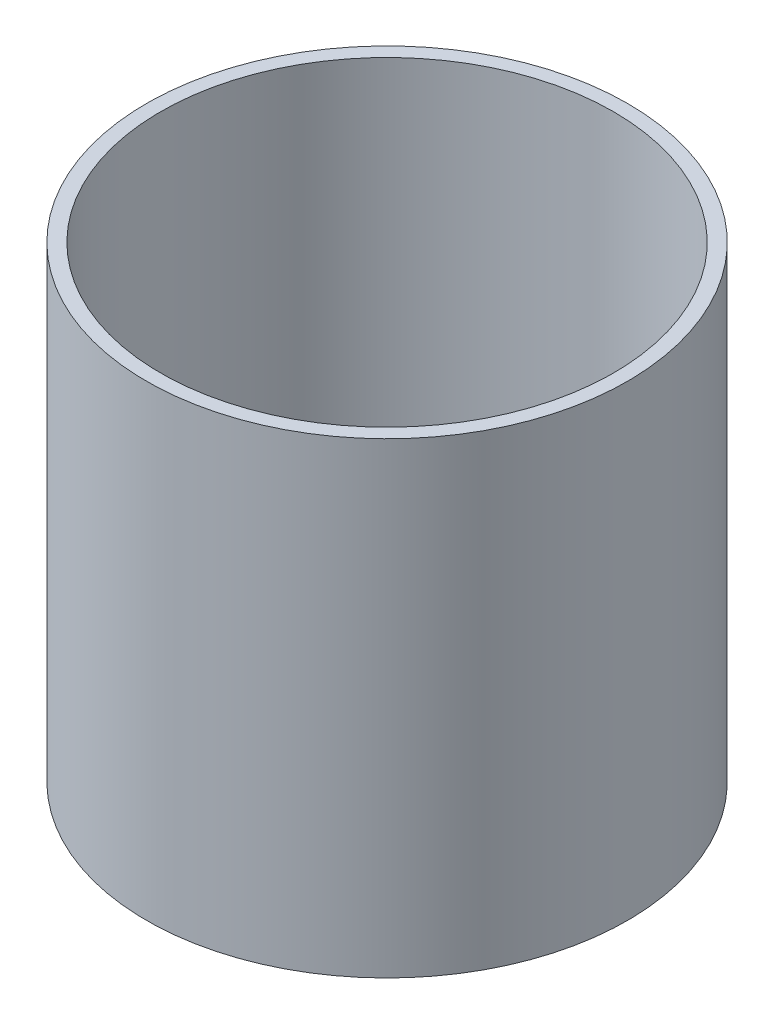
ISO-10303-21;
HEADER;
FILE_DESCRIPTION(('STEP AP214'),'2;1');
FILE_NAME('part.step','',(''),(''),'','','');
FILE_SCHEMA(('AUTOMOTIVE_DESIGN { 1 0 10303 214 1 1 1 1 }'));
ENDSEC;
DATA;
#1=APPLICATION_CONTEXT('core data for automotive mechanical design processes');
#2=APPLICATION_PROTOCOL_DEFINITION('international standard','automotive_design',2000,#1);
#3=PRODUCT_CONTEXT('',#1,'mechanical');
#4=PRODUCT('Part','Part','',(#3));
#5=PRODUCT_RELATED_PRODUCT_CATEGORY('part','',(#4));
#6=PRODUCT_DEFINITION_FORMATION('','',#4);
#7=PRODUCT_DEFINITION_CONTEXT('part definition',#1,'design');
#8=PRODUCT_DEFINITION('design','',#6,#7);
#9=PRODUCT_DEFINITION_SHAPE('','',#8);
#10=(LENGTH_UNIT() NAMED_UNIT(*) SI_UNIT(.MILLI.,.METRE.));
#11=(NAMED_UNIT(*) PLANE_ANGLE_UNIT() SI_UNIT($,.RADIAN.));
#12=(NAMED_UNIT(*) SI_UNIT($,.STERADIAN.) SOLID_ANGLE_UNIT());
#13=UNCERTAINTY_MEASURE_WITH_UNIT(LENGTH_MEASURE(1.E-05),#10,'distance_accuracy_value','');
#14=(GEOMETRIC_REPRESENTATION_CONTEXT(3) GLOBAL_UNCERTAINTY_ASSIGNED_CONTEXT((#13)) GLOBAL_UNIT_ASSIGNED_CONTEXT((#10,
#11,#12)) REPRESENTATION_CONTEXT('',''));
#15=CARTESIAN_POINT('',(0.,0.,0.));
#16=DIRECTION('',(0.,0.,1.));
#17=DIRECTION('',(1.,0.,0.));
#18=AXIS2_PLACEMENT_3D('',#15,#16,#17);
#19=CARTESIAN_POINT('',(0.,0.,0.));
#20=DIRECTION('',(0.,-1.,0.));
#21=DIRECTION('',(0.,0.,-1.));
#22=AXIS2_PLACEMENT_3D('',#19,#20,#21);
#23=CYLINDRICAL_SURFACE('',#22,85.0000000000001);
#24=CARTESIAN_POINT('',(0.,85.,0.));
#25=DIRECTION('',(0.,-1.,0.));
#26=DIRECTION('',(0.,0.,-1.));
#27=AXIS2_PLACEMENT_3D('',#24,#25,#26);
#28=CIRCLE('',#27,85.);
#29=CARTESIAN_POINT('',(0.,85.,-85.));
#30=VERTEX_POINT('',#29);
#31=EDGE_CURVE('E78',#30,#30,#28,.T.);
#32=ORIENTED_EDGE('',*,*,#31,.T.);
#33=EDGE_LOOP('',(#32));
#34=FACE_BOUND('',#33,.T.);
#35=CARTESIAN_POINT('',(0.,-80.,0.));
#36=DIRECTION('',(0.,-1.,0.));
#37=DIRECTION('',(0.,0.,-1.));
#38=AXIS2_PLACEMENT_3D('',#35,#36,#37);
#39=CIRCLE('',#38,85.0000000000002);
#40=CARTESIAN_POINT('',(0.,-80.,-85.0000000000002));
#41=VERTEX_POINT('',#40);
#42=EDGE_CURVE('E12',#41,#41,#39,.T.);
#43=ORIENTED_EDGE('',*,*,#42,.F.);
#44=EDGE_LOOP('',(#43));
#45=FACE_BOUND('',#44,.T.);
#46=ADVANCED_FACE('F57',(#34,#45),#23,.T.);
#47=CARTESIAN_POINT('',(85.0000000000002,-80.,0.));
#48=DIRECTION('',(0.,-1.,0.));
#49=DIRECTION('',(0.,0.,-1.));
#50=AXIS2_PLACEMENT_3D('',#47,#48,#49);
#51=PLANE('',#50);
#52=CARTESIAN_POINT('',(0.,-80.,0.));
#53=DIRECTION('',(0.,-1.,0.));
#54=DIRECTION('',(0.,0.,-1.));
#55=AXIS2_PLACEMENT_3D('',#52,#53,#54);
#56=CIRCLE('',#55,12.5);
#57=CARTESIAN_POINT('',(0.,-80.,-12.5));
#58=VERTEX_POINT('',#57);
#59=EDGE_CURVE('E84',#58,#58,#56,.T.);
#60=ORIENTED_EDGE('',*,*,#59,.F.);
#61=EDGE_LOOP('',(#60));
#62=FACE_BOUND('',#61,.T.);
#63=ORIENTED_EDGE('',*,*,#42,.T.);
#64=EDGE_LOOP('',(#63));
#65=FACE_BOUND('',#64,.T.);
#66=ADVANCED_FACE('F97',(#62,#65),#51,.T.);
#67=CARTESIAN_POINT('',(80.,-75.,0.));
#68=DIRECTION('',(0.,1.,0.));
#69=DIRECTION('',(0.,0.,1.));
#70=AXIS2_PLACEMENT_3D('',#67,#68,#69);
#71=PLANE('',#70);
#72=CARTESIAN_POINT('',(0.,-75.,0.));
#73=DIRECTION('',(0.,1.,0.));
#74=DIRECTION('',(0.,0.,1.));
#75=AXIS2_PLACEMENT_3D('',#72,#73,#74);
#76=CIRCLE('',#75,12.5);
#77=CARTESIAN_POINT('',(0.,-75.,12.5));
#78=VERTEX_POINT('',#77);
#79=EDGE_CURVE('E85',#78,#78,#76,.F.);
#80=ORIENTED_EDGE('',*,*,#79,.T.);
#81=EDGE_LOOP('',(#80));
#82=FACE_BOUND('',#81,.T.);
#83=CARTESIAN_POINT('',(0.,-75.,0.));
#84=DIRECTION('',(0.,-1.,0.));
#85=DIRECTION('',(0.,0.,-1.));
#86=AXIS2_PLACEMENT_3D('',#83,#84,#85);
#87=CIRCLE('',#86,80.);
#88=CARTESIAN_POINT('',(0.,-75.,-80.));
#89=VERTEX_POINT('',#88);
#90=EDGE_CURVE('E64',#89,#89,#87,.T.);
#91=ORIENTED_EDGE('',*,*,#90,.F.);
#92=EDGE_LOOP('',(#91));
#93=FACE_BOUND('',#92,.T.);
#94=ADVANCED_FACE('F99',(#82,#93),#71,.T.);
#95=CARTESIAN_POINT('',(0.,0.,0.));
#96=DIRECTION('',(0.,-1.,0.));
#97=DIRECTION('',(0.,0.,-1.));
#98=AXIS2_PLACEMENT_3D('',#95,#96,#97);
#99=CYLINDRICAL_SURFACE('',#98,80.);
#100=ORIENTED_EDGE('',*,*,#90,.T.);
#101=EDGE_LOOP('',(#100));
#102=FACE_BOUND('',#101,.T.);
#103=CARTESIAN_POINT('',(0.,85.,0.));
#104=DIRECTION('',(0.,-1.,0.));
#105=DIRECTION('',(0.,0.,-1.));
#106=AXIS2_PLACEMENT_3D('',#103,#104,#105);
#107=CIRCLE('',#106,80.);
#108=CARTESIAN_POINT('',(0.,85.,-80.));
#109=VERTEX_POINT('',#108);
#110=EDGE_CURVE('E71',#109,#109,#107,.T.);
#111=ORIENTED_EDGE('',*,*,#110,.F.);
#112=EDGE_LOOP('',(#111));
#113=FACE_BOUND('',#112,.T.);
#114=ADVANCED_FACE('F104',(#102,#113),#99,.F.);
#115=CARTESIAN_POINT('',(80.,85.,0.));
#116=DIRECTION('',(0.,1.,0.));
#117=DIRECTION('',(0.,0.,1.));
#118=AXIS2_PLACEMENT_3D('',#115,#116,#117);
#119=PLANE('',#118);
#120=ORIENTED_EDGE('',*,*,#110,.T.);
#121=EDGE_LOOP('',(#120));
#122=FACE_BOUND('',#121,.T.);
#123=ORIENTED_EDGE('',*,*,#31,.F.);
#124=EDGE_LOOP('',(#123));
#125=FACE_BOUND('',#124,.T.);
#126=ADVANCED_FACE('F111',(#122,#125),#119,.T.);
#127=CARTESIAN_POINT('',(0.,85.001,0.));
#128=DIRECTION('',(0.,-1.,0.));
#129=DIRECTION('',(0.,0.,-1.));
#130=AXIS2_PLACEMENT_3D('',#127,#128,#129);
#131=CYLINDRICAL_SURFACE('',#130,12.5);
#132=ORIENTED_EDGE('',*,*,#79,.F.);
#133=EDGE_LOOP('',(#132));
#134=FACE_BOUND('',#133,.T.);
#135=ORIENTED_EDGE('',*,*,#59,.T.);
#136=EDGE_LOOP('',(#135));
#137=FACE_BOUND('',#136,.T.);
#138=ADVANCED_FACE('F95',(#134,#137),#131,.F.);
#139=CLOSED_SHELL('',(#46,#66,#94,#114,#126,#138));
#140=MANIFOLD_SOLID_BREP('B2',#139);
#141=ADVANCED_BREP_SHAPE_REPRESENTATION('',(#18,#140),#14);
#142=SHAPE_DEFINITION_REPRESENTATION(#9,#141);
ENDSEC;
END-ISO-10303-21;
